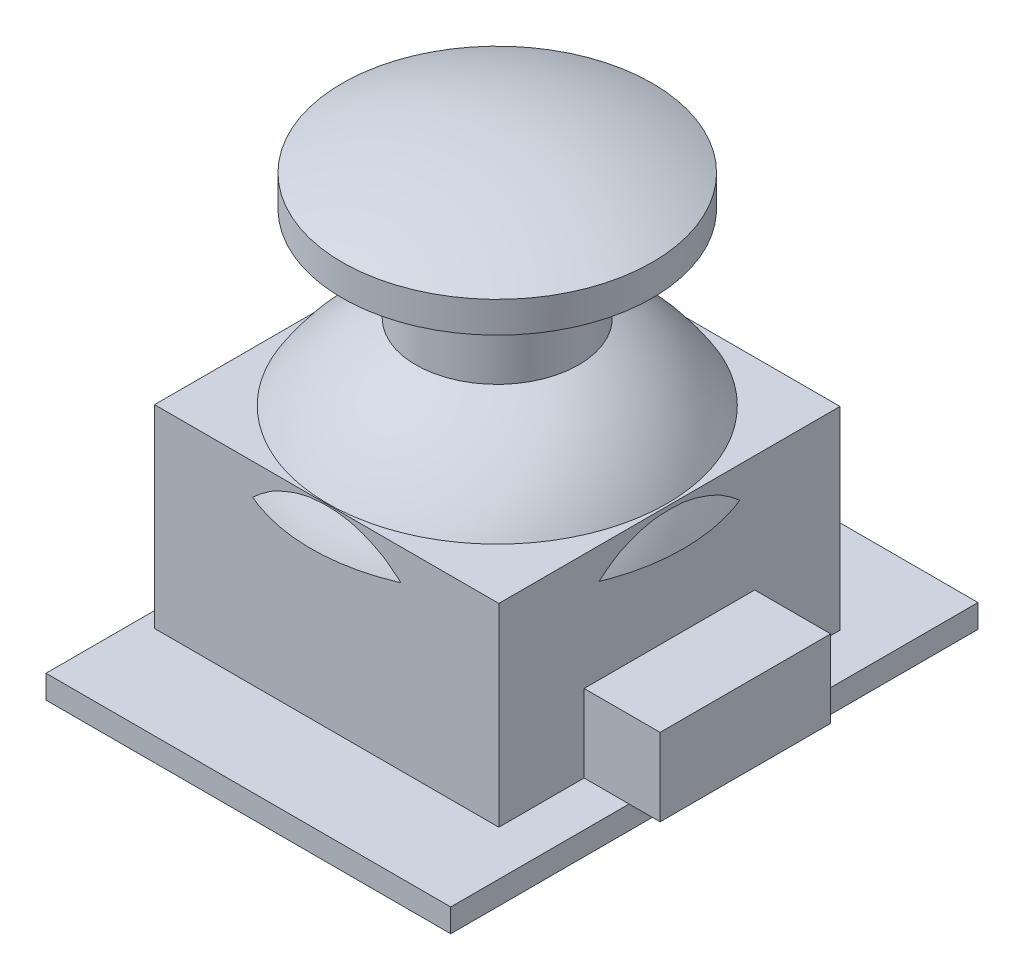
ISO-10303-21;
HEADER;
FILE_DESCRIPTION(('STEP AP214'),'2;1');
FILE_NAME('part.step','',(''),(''),'','','');
FILE_SCHEMA(('AUTOMOTIVE_DESIGN { 1 0 10303 214 1 1 1 1 }'));
ENDSEC;
DATA;
#1=APPLICATION_CONTEXT('core data for automotive mechanical design processes');
#2=APPLICATION_PROTOCOL_DEFINITION('international standard','automotive_design',2000,#1);
#3=PRODUCT_CONTEXT('',#1,'mechanical');
#4=PRODUCT('Part','Part','',(#3));
#5=PRODUCT_RELATED_PRODUCT_CATEGORY('part','',(#4));
#6=PRODUCT_DEFINITION_FORMATION('','',#4);
#7=PRODUCT_DEFINITION_CONTEXT('part definition',#1,'design');
#8=PRODUCT_DEFINITION('design','',#6,#7);
#9=PRODUCT_DEFINITION_SHAPE('','',#8);
#10=(LENGTH_UNIT() NAMED_UNIT(*) SI_UNIT(.MILLI.,.METRE.));
#11=(NAMED_UNIT(*) PLANE_ANGLE_UNIT() SI_UNIT($,.RADIAN.));
#12=(NAMED_UNIT(*) SI_UNIT($,.STERADIAN.) SOLID_ANGLE_UNIT());
#13=UNCERTAINTY_MEASURE_WITH_UNIT(LENGTH_MEASURE(1.E-05),#10,'distance_accuracy_value','');
#14=(GEOMETRIC_REPRESENTATION_CONTEXT(3) GLOBAL_UNCERTAINTY_ASSIGNED_CONTEXT((#13)) GLOBAL_UNIT_ASSIGNED_CONTEXT((#10,
#11,#12)) REPRESENTATION_CONTEXT('',''));
#15=CARTESIAN_POINT('',(0.,0.,0.));
#16=DIRECTION('',(0.,0.,1.));
#17=DIRECTION('',(1.,0.,0.));
#18=AXIS2_PLACEMENT_3D('',#15,#16,#17);
#19=CARTESIAN_POINT('',(4.3,25.0000000000001,0.));
#20=DIRECTION('',(0.,-1.,0.));
#21=DIRECTION('',(0.,0.,-1.));
#22=AXIS2_PLACEMENT_3D('',#19,#20,#21);
#23=PLANE('',#22);
#24=CARTESIAN_POINT('',(-0.95,25.0000000000001,0.));
#25=DIRECTION('',(0.,-1.,0.));
#26=DIRECTION('',(0.,0.,-1.));
#27=AXIS2_PLACEMENT_3D('',#24,#25,#26);
#28=CIRCLE('',#27,10.);
#29=CARTESIAN_POINT('',(-0.95,25.0000000000001,-10.));
#30=VERTEX_POINT('',#29);
#31=EDGE_CURVE('E77',#30,#30,#28,.T.);
#32=ORIENTED_EDGE('',*,*,#31,.T.);
#33=EDGE_LOOP('',(#32));
#34=FACE_BOUND('',#33,.T.);
#35=CARTESIAN_POINT('',(-0.95,25.0000000000001,0.));
#36=DIRECTION('',(0.,-1.,0.));
#37=DIRECTION('',(0.,0.,-1.));
#38=AXIS2_PLACEMENT_3D('',#35,#36,#37);
#39=CIRCLE('',#38,5.25);
#40=CARTESIAN_POINT('',(-0.95,25.0000000000001,-5.25));
#41=VERTEX_POINT('',#40);
#42=EDGE_CURVE('E12',#41,#41,#39,.T.);
#43=ORIENTED_EDGE('',*,*,#42,.F.);
#44=EDGE_LOOP('',(#43));
#45=FACE_BOUND('',#44,.T.);
#46=ADVANCED_FACE('F52',(#34,#45),#23,.T.);
#47=CARTESIAN_POINT('',(-0.95,-961.886040234275,0.));
#48=DIRECTION('',(0.,-1.,0.));
#49=DIRECTION('',(0.,0.,-1.));
#50=AXIS2_PLACEMENT_3D('',#47,#48,#49);
#51=CYLINDRICAL_SURFACE('',#50,5.25);
#52=ORIENTED_EDGE('',*,*,#42,.T.);
#53=EDGE_LOOP('',(#52));
#54=FACE_BOUND('',#53,.T.);
#55=CARTESIAN_POINT('',(-0.95,18.8927498922663,0.));
#56=DIRECTION('',(0.,-1.,0.));
#57=DIRECTION('',(0.,0.,-1.));
#58=AXIS2_PLACEMENT_3D('',#55,#56,#57);
#59=CIRCLE('',#58,5.25);
#60=CARTESIAN_POINT('',(4.30000000000006,18.8927498922663,0.));
#61=VERTEX_POINT('',#60);
#62=EDGE_CURVE('E58',#61,#61,#59,.T.);
#63=ORIENTED_EDGE('',*,*,#62,.F.);
#64=EDGE_LOOP('',(#63));
#65=FACE_BOUND('',#64,.T.);
#66=ADVANCED_FACE('F95',(#54,#65),#51,.T.);
#67=CARTESIAN_POINT('',(-0.95,7.00000000000012,0.));
#68=DIRECTION('',(0.,-1.,0.));
#69=DIRECTION('',(1.,0.,0.));
#70=AXIS2_PLACEMENT_3D('',#67,#68,#69);
#71=SPHERICAL_SURFACE('',#70,12.9999999999999);
#72=CARTESIAN_POINT('',(-0.95,12.0000000000001,0.));
#73=DIRECTION('',(0.,-1.,0.));
#74=DIRECTION('',(0.,0.,-1.));
#75=AXIS2_PLACEMENT_3D('',#72,#73,#74);
#76=CIRCLE('',#75,11.9999999999999);
#77=CARTESIAN_POINT('',(11.0499999999999,12.0000000000001,0.));
#78=VERTEX_POINT('',#77);
#79=EDGE_CURVE('E62',#78,#78,#76,.T.);
#80=CARTESIAN_POINT('',(4.30000000000006,18.8927498922663,0.));
#81=CARTESIAN_POINT('',(4.39418672031377,18.8511718666741,0.));
#82=CARTESIAN_POINT('',(4.48787930585906,18.8084745099224,0.));
#83=CARTESIAN_POINT('',(4.67422378465902,18.7208662206368,0.));
#84=CARTESIAN_POINT('',(4.76687567791369,18.6759552881029,0.));
#85=CARTESIAN_POINT('',(4.95108634937865,18.5839449337896,0.));
#86=CARTESIAN_POINT('',(5.04264512758895,18.5368455120101,0.));
#87=CARTESIAN_POINT('',(5.22461792063713,18.4404848358626,0.));
#88=CARTESIAN_POINT('',(5.31503193547502,18.3912235814946,0.));
#89=CARTESIAN_POINT('',(5.49466415745175,18.2905670273936,0.));
#90=CARTESIAN_POINT('',(5.58388236459059,18.2391717276606,0.));
#91=CARTESIAN_POINT('',(5.7610726131334,18.1342760986818,0.));
#92=CARTESIAN_POINT('',(5.84904465453736,18.080775769436,0.));
#93=CARTESIAN_POINT('',(6.02369291396159,17.9717002790548,0.));
#94=CARTESIAN_POINT('',(6.11036913198186,17.9161251179196,0.));
#95=CARTESIAN_POINT('',(6.2823768192463,17.8029313342759,0.));
#96=CARTESIAN_POINT('',(6.36770828849047,17.7453127117675,0.));
#97=CARTESIAN_POINT('',(6.53697831165454,17.6280645288908,0.));
#98=CARTESIAN_POINT('',(6.62091686557444,17.5684349685225,0.));
#99=CARTESIAN_POINT('',(6.78735367784997,17.4471985686642,0.));
#100=CARTESIAN_POINT('',(6.86985193620558,17.3855917291743,0.));
#101=CARTESIAN_POINT('',(7.03336159009123,17.2604355458797,0.));
#102=CARTESIAN_POINT('',(7.11437298562125,17.196886202075,0.));
#103=CARTESIAN_POINT('',(7.27486318587842,17.0678808814398,0.));
#104=CARTESIAN_POINT('',(7.35434199060556,17.0024249046093,0.));
#105=CARTESIAN_POINT('',(7.51172214637016,16.8696432654333,0.));
#106=CARTESIAN_POINT('',(7.58962349740762,16.8023176030879,0.));
#107=CARTESIAN_POINT('',(7.74380477332143,16.6658345957634,0.));
#108=CARTESIAN_POINT('',(7.82008469819778,16.5966772507843,0.));
#109=CARTESIAN_POINT('',(7.97098006455382,16.4565699149912,0.));
#110=CARTESIAN_POINT('',(8.04559550603349,16.3856199241772,0.));
#111=CARTESIAN_POINT('',(8.1931197879008,16.2419673453967,0.));
#112=CARTESIAN_POINT('',(8.26602862828843,16.1692647574302,0.));
#113=CARTESIAN_POINT('',(8.41009855359032,16.0221480223037,0.));
#114=CARTESIAN_POINT('',(8.48125963850459,15.9477338751439,0.));
#115=CARTESIAN_POINT('',(8.62179388502267,15.7972360257029,0.));
#116=CARTESIAN_POINT('',(8.69116704662649,15.7211523234219,0.));
#117=CARTESIAN_POINT('',(8.82808628790408,15.5673583102135,0.));
#118=CARTESIAN_POINT('',(8.89563236757786,15.4896479992863,0.));
#119=CARTESIAN_POINT('',(9.02885931769694,15.332644633422,0.));
#120=CARTESIAN_POINT('',(9.09454018814224,15.2533515784849,0.));
#121=CARTESIAN_POINT('',(9.22399964534833,15.0932274826384,0.));
#122=CARTESIAN_POINT('',(9.28777823210913,15.012396441729,0.));
#123=CARTESIAN_POINT('',(9.41339712126059,14.8492420001127,0.));
#124=CARTESIAN_POINT('',(9.47523742365126,14.7669185994058,0.));
#125=CARTESIAN_POINT('',(9.59694483746529,14.6008259067508,0.));
#126=CARTESIAN_POINT('',(9.65681194888864,14.5170566148028,0.));
#127=CARTESIAN_POINT('',(9.77453918797416,14.3481194243789,0.));
#128=CARTESIAN_POINT('',(9.83239931563632,14.262951525903,0.));
#129=CARTESIAN_POINT('',(9.94607992724119,14.0912651965841,0.));
#130=CARTESIAN_POINT('',(10.0019004111839,14.0047467657411,0.));
#131=CARTESIAN_POINT('',(10.1114702268212,13.8304082082306,0.));
#132=CARTESIAN_POINT('',(10.1652195585158,13.7425880815631,0.));
#133=CARTESIAN_POINT('',(10.2706167297512,13.5656957034985,0.));
#134=CARTESIAN_POINT('',(10.3222645692921,13.4766234521013,0.));
#135=CARTESIAN_POINT('',(10.4234296042724,13.2972771032259,0.));
#136=CARTESIAN_POINT('',(10.4729467997119,13.2070030057476,0.));
#137=CARTESIAN_POINT('',(10.5698225907102,13.0253039188643,0.));
#138=CARTESIAN_POINT('',(10.617181186269,12.9338789294592,0.));
#139=CARTESIAN_POINT('',(10.7097130644459,12.7499296733084,0.));
#140=CARTESIAN_POINT('',(10.754886347064,12.6574054065628,0.));
#141=CARTESIAN_POINT('',(10.8430220292575,12.4713097905297,0.));
#142=CARTESIAN_POINT('',(10.8859844288328,12.3777384412423,0.));
#143=CARTESIAN_POINT('',(10.9696743608196,12.1896015963266,0.));
#144=CARTESIAN_POINT('',(11.010401893231,12.0950361006983,0.));
#145=CARTESIAN_POINT('',(11.0499999999999,12.0000000000001,0.));
#146=B_SPLINE_CURVE_WITH_KNOTS('',3,(#80,#81,#82,#83,#84,#85,#86,#87,#88,#89,#90,#91,#92,#93,
#94,#95,#96,#97,#98,#99,#100,#101,#102,#103,#104,#105,#106,#107,#108,#109,#110,#111,#112,#113,
#114,#115,#116,#117,#118,#119,#120,#121,#122,#123,#124,#125,#126,#127,#128,#129,#130,#131,#132,
#133,#134,#135,#136,#137,#138,#139,#140,#141,#142,#143,#144,#145),.UNSPECIFIED.,.F.,.F.,(4,2,2,
2,2,2,2,2,2,2,2,2,2,2,2,2,2,2,2,2,2,2,2,2,2,2,2,2,2,2,2,2,4),(0.,0.308859735682066,
0.617719471364132,0.926579207046198,1.23543894272826,1.54429867841033,1.85315841409239,
2.16201814977446,2.47087788545653,2.77973762113859,3.08859735682066,3.39745709250272,
3.70631682818479,4.01517656386685,4.32403629954892,4.63289603523098,4.94175577091305,
5.25061550659512,5.55947524227718,5.86833497795925,6.17719471364132,6.48605444932338,
6.79491418500545,7.10377392068751,7.41263365636958,7.72149339205164,8.03035312773371,
8.33921286341577,8.64807259909784,8.9569323347799,9.26579207046197,9.57465180614404,
9.8835115418261),.UNSPECIFIED.);
#147=EDGE_CURVE('BSEAM99',#61,#78,#146,.T.);
#148=ORIENTED_EDGE('',*,*,#62,.T.);
#149=ORIENTED_EDGE('',*,*,#79,.F.);
#150=ORIENTED_EDGE('',*,*,#147,.T.);
#151=ORIENTED_EDGE('',*,*,#147,.F.);
#152=EDGE_LOOP('',(#148,#150,#149,#151));
#153=FACE_BOUND('',#152,.T.);
#154=ADVANCED_FACE('F99',(#153),#71,.T.);
#155=CARTESIAN_POINT('',(10.5064392373896,12.0000000000001,0.));
#156=DIRECTION('',(0.,-1.,0.));
#157=DIRECTION('',(0.,0.,-1.));
#158=AXIS2_PLACEMENT_3D('',#155,#156,#157);
#159=PLANE('',#158);
#160=ORIENTED_EDGE('',*,*,#79,.T.);
#161=EDGE_LOOP('',(#160));
#162=FACE_BOUND('',#161,.T.);
#163=CARTESIAN_POINT('',(-0.95,12.0000000000001,0.));
#164=DIRECTION('',(0.,-1.,0.));
#165=DIRECTION('',(0.,0.,-1.));
#166=AXIS2_PLACEMENT_3D('',#163,#164,#165);
#167=CIRCLE('',#166,11.4564392373896);
#168=CARTESIAN_POINT('',(10.5064392373895,12.0000000000001,0.));
#169=VERTEX_POINT('',#168);
#170=EDGE_CURVE('E66',#169,#169,#167,.T.);
#171=ORIENTED_EDGE('',*,*,#170,.F.);
#172=EDGE_LOOP('',(#171));
#173=FACE_BOUND('',#172,.T.);
#174=ADVANCED_FACE('F103',(#162,#173),#159,.T.);
#175=CARTESIAN_POINT('',(-0.950000000000006,7.00000000000012,0.));
#176=DIRECTION('',(0.,-1.,0.));
#177=DIRECTION('',(1.,0.,0.));
#178=AXIS2_PLACEMENT_3D('',#175,#176,#177);
#179=SPHERICAL_SURFACE('',#178,12.4999999999999);
#180=CARTESIAN_POINT('',(-0.95,18.3440513045384,0.));
#181=DIRECTION('',(0.,-1.,0.));
#182=DIRECTION('',(0.,0.,-1.));
#183=AXIS2_PLACEMENT_3D('',#180,#181,#182);
#184=CIRCLE('',#183,5.25000000000002);
#185=CARTESIAN_POINT('',(4.30000000000013,18.3440513045384,0.));
#186=VERTEX_POINT('',#185);
#187=EDGE_CURVE('E71',#186,#186,#184,.T.);
#188=CARTESIAN_POINT('',(10.5064392373895,12.0000000000001,0.));
#189=CARTESIAN_POINT('',(10.4686355545706,12.0866196139958,0.));
#190=CARTESIAN_POINT('',(10.4298491526026,12.1728103257044,0.));
#191=CARTESIAN_POINT('',(10.3503316536855,12.3442899682968,0.));
#192=CARTESIAN_POINT('',(10.3096005567365,12.4295788991805,0.));
#193=CARTESIAN_POINT('',(10.2262144111743,12.599211003872,0.));
#194=CARTESIAN_POINT('',(10.1835593625611,12.6835541776798,0.));
#195=CARTESIAN_POINT('',(10.0963473148718,12.851251402839,0.));
#196=CARTESIAN_POINT('',(10.0517903157956,12.9346054541903,0.));
#197=CARTESIAN_POINT('',(9.96079727503803,13.1002815446163,0.));
#198=CARTESIAN_POINT('',(9.91436123335662,13.1826035836909,0.));
#199=CARTESIAN_POINT('',(9.81963400119598,13.3461732996029,0.));
#200=CARTESIAN_POINT('',(9.77134281071675,13.4274209764403,0.));
#201=CARTESIAN_POINT('',(9.67293012402063,13.5888001682483,0.));
#202=CARTESIAN_POINT('',(9.62280862780375,13.6689316832188,0.));
#203=CARTESIAN_POINT('',(9.52076111570348,13.828037326531,0.));
#204=CARTESIAN_POINT('',(9.4688350998201,13.9070114548726,0.));
#205=CARTESIAN_POINT('',(9.36320526245077,14.0637616954284,0.));
#206=CARTESIAN_POINT('',(9.30950144096483,14.1415378076427,0.));
#207=CARTESIAN_POINT('',(9.20034362117312,14.2958520028294,0.));
#208=CARTESIAN_POINT('',(9.14488962286736,14.3723900858019,0.));
#209=CARTESIAN_POINT('',(9.03225997859773,14.5241888463016,0.));
#210=CARTESIAN_POINT('',(8.97508433263386,14.5994495238289,0.));
#211=CARTESIAN_POINT('',(8.8590408079451,14.748654754419,0.));
#212=CARTESIAN_POINT('',(8.80017292922022,14.8225993074818,0.));
#213=CARTESIAN_POINT('',(8.68077522449996,14.9691342472237,0.));
#214=CARTESIAN_POINT('',(8.62024539850458,15.0417246339027,0.));
#215=CARTESIAN_POINT('',(8.49755493974884,15.1855138956294,0.));
#216=CARTESIAN_POINT('',(8.43539430698847,15.2567127706772,0.));
#217=CARTESIAN_POINT('',(8.30947421420189,15.3976823797787,0.));
#218=CARTESIAN_POINT('',(8.24571475417568,15.4674531138324,0.));
#219=CARTESIAN_POINT('',(8.11662980889801,15.6055305463125,0.));
#220=CARTESIAN_POINT('',(8.05130432364655,15.6738372447387,0.));
#221=CARTESIAN_POINT('',(7.91912093562489,15.808951464526,0.));
#222=CARTESIAN_POINT('',(7.85226303285468,15.8757589858871,0.));
#223=CARTESIAN_POINT('',(7.71704920587791,16.007840481381,0.));
#224=CARTESIAN_POINT('',(7.64869328167135,16.0731144555139,0.));
#225=CARTESIAN_POINT('',(7.51051857858457,16.2020952753457,0.));
#226=CARTESIAN_POINT('',(7.44069979970435,16.2658021210447,0.));
#227=CARTESIAN_POINT('',(7.29963530662119,16.3916159090363,0.));
#228=CARTESIAN_POINT('',(7.22838959241825,16.453722851329,0.));
#229=CARTESIAN_POINT('',(7.08450788214944,16.5763048806308,0.));
#230=CARTESIAN_POINT('',(7.01187188608359,16.6367799676398,0.));
#231=CARTESIAN_POINT('',(6.86524698080104,16.7560671740306,0.));
#232=CARTESIAN_POINT('',(6.79125807158435,16.8148792934124,0.));
#233=CARTESIAN_POINT('',(6.64196540473839,16.9308103077423,0.));
#234=CARTESIAN_POINT('',(6.56666164710912,16.9879292026906,0.));
#235=CARTESIAN_POINT('',(6.41477802462381,17.10044438246,0.));
#236=CARTESIAN_POINT('',(6.33819815976777,17.1558406672812,0.));
#237=CARTESIAN_POINT('',(6.18380172051494,17.2648821273,0.));
#238=CARTESIAN_POINT('',(6.10598514611815,17.3185273024977,0.));
#239=CARTESIAN_POINT('',(5.94915532176236,17.4240389447565,0.));
#240=CARTESIAN_POINT('',(5.87014207180336,17.4759054118177,0.));
#241=CARTESIAN_POINT('',(5.71095954577016,17.5778329540084,0.));
#242=CARTESIAN_POINT('',(5.63079026969597,17.6278940291379,0.));
#243=CARTESIAN_POINT('',(5.46933693628586,17.726185033849,0.));
#244=CARTESIAN_POINT('',(5.38805287894995,17.7744149634307,0.));
#245=CARTESIAN_POINT('',(5.22441179888237,17.8690188603877,0.));
#246=CARTESIAN_POINT('',(5.14205477615071,17.915392827763,0.));
#247=CARTESIAN_POINT('',(4.97631014250623,18.0062609575243,0.));
#248=CARTESIAN_POINT('',(4.89292253159343,18.0507551199101,0.));
#249=CARTESIAN_POINT('',(4.72515959412726,18.1378406929204,0.));
#250=CARTESIAN_POINT('',(4.64078426757391,18.1804321035448,0.));
#251=CARTESIAN_POINT('',(4.47108940967204,18.2636904704474,0.));
#252=CARTESIAN_POINT('',(4.38576987832352,18.3043574267256,0.));
#253=CARTESIAN_POINT('',(4.30000000000013,18.3440513045384,0.));
#254=B_SPLINE_CURVE_WITH_KNOTS('',3,(#188,#189,#190,#191,#192,#193,#194,#195,#196,#197,#198,
#199,#200,#201,#202,#203,#204,#205,#206,#207,#208,#209,#210,#211,#212,#213,#214,#215,#216,#217,
#218,#219,#220,#221,#222,#223,#224,#225,#226,#227,#228,#229,#230,#231,#232,#233,#234,#235,#236,
#237,#238,#239,#240,#241,#242,#243,#244,#245,#246,#247,#248,#249,#250,#251,#252,#253),
.UNSPECIFIED.,.F.,.F.,(4,2,2,2,2,2,2,2,2,2,2,2,2,2,2,2,2,2,2,2,2,2,2,2,2,2,2,2,2,2,2,2,4),(0.,
0.283522891040992,0.567045782081985,0.850568673122977,1.13409156416397,1.41761445520496,
1.70113734624595,1.98466023728694,2.26818312832793,2.55170601936893,2.83522891040992,
3.11875180145091,3.4022746924919,3.68579758353289,3.96932047457388,4.25284336561488,
4.53636625665587,4.81988914769686,5.10341203873785,5.38693492977884,5.67045782081983,
5.95398071186083,6.23750360290182,6.52102649394281,6.8045493849838,7.08807227602479,
7.37159516706578,7.65511805810678,7.93864094914777,8.22216384018876,8.50568673122975,
8.78920962227074,9.07273251331173),.UNSPECIFIED.);
#255=EDGE_CURVE('BSEAM109',#169,#186,#254,.T.);
#256=ORIENTED_EDGE('',*,*,#170,.T.);
#257=ORIENTED_EDGE('',*,*,#187,.F.);
#258=ORIENTED_EDGE('',*,*,#255,.T.);
#259=ORIENTED_EDGE('',*,*,#255,.F.);
#260=EDGE_LOOP('',(#256,#258,#257,#259));
#261=FACE_BOUND('',#260,.T.);
#262=ADVANCED_FACE('F109',(#261),#179,.F.);
#263=CARTESIAN_POINT('',(4.3,18.3440513045384,0.));
#264=DIRECTION('',(0.,-1.,0.));
#265=DIRECTION('',(0.,0.,-1.));
#266=AXIS2_PLACEMENT_3D('',#263,#264,#265);
#267=PLANE('',#266);
#268=ORIENTED_EDGE('',*,*,#187,.T.);
#269=EDGE_LOOP('',(#268));
#270=FACE_BOUND('',#269,.T.);
#271=ADVANCED_FACE('F91',(#270),#267,.T.);
#272=CARTESIAN_POINT('',(-0.95,5.37272727272611,0.));
#273=DIRECTION('',(0.,-1.,0.));
#274=DIRECTION('',(1.,0.,0.));
#275=AXIS2_PLACEMENT_3D('',#272,#273,#274);
#276=SPHERICAL_SURFACE('',#275,23.8272727272739);
#277=CARTESIAN_POINT('',(-0.95,27.0000000000001,0.));
#278=DIRECTION('',(0.,-1.,0.));
#279=DIRECTION('',(0.,0.,-1.));
#280=AXIS2_PLACEMENT_3D('',#277,#278,#279);
#281=CIRCLE('',#280,10.);
#282=CARTESIAN_POINT('',(-0.95,27.0000000000001,-10.));
#283=VERTEX_POINT('',#282);
#284=EDGE_CURVE('E74',#283,#283,#281,.T.);
#285=ORIENTED_EDGE('',*,*,#284,.F.);
#286=EDGE_LOOP('',(#285));
#287=FACE_BOUND('',#286,.T.);
#288=ADVANCED_FACE('F85',(#287),#276,.T.);
#289=CARTESIAN_POINT('',(-0.95,-961.886040234275,0.));
#290=DIRECTION('',(0.,-1.,0.));
#291=DIRECTION('',(0.,0.,-1.));
#292=AXIS2_PLACEMENT_3D('',#289,#290,#291);
#293=CYLINDRICAL_SURFACE('',#292,10.);
#294=ORIENTED_EDGE('',*,*,#284,.T.);
#295=EDGE_LOOP('',(#294));
#296=FACE_BOUND('',#295,.T.);
#297=ORIENTED_EDGE('',*,*,#31,.F.);
#298=EDGE_LOOP('',(#297));
#299=FACE_BOUND('',#298,.T.);
#300=ADVANCED_FACE('F83',(#296,#299),#293,.T.);
#301=CLOSED_SHELL('',(#46,#66,#154,#174,#262,#271,#288,#300));
#302=MANIFOLD_SOLID_BREP('B2',#301);
#303=CARTESIAN_POINT('',(0.,21.5,0.));
#304=DIRECTION('',(0.,-1.,0.));
#305=DIRECTION('',(0.,0.,-1.));
#306=AXIS2_PLACEMENT_3D('',#303,#304,#305);
#307=CYLINDRICAL_SURFACE('',#306,2.);
#308=CARTESIAN_POINT('',(0.,14.,0.));
#309=DIRECTION('',(0.,1.,0.));
#310=DIRECTION('',(0.,0.,1.));
#311=AXIS2_PLACEMENT_3D('',#308,#309,#310);
#312=CIRCLE('',#311,2.);
#313=CARTESIAN_POINT('',(0.,14.,2.));
#314=VERTEX_POINT('',#313);
#315=EDGE_CURVE('E291',#314,#314,#312,.T.);
#316=ORIENTED_EDGE('',*,*,#315,.T.);
#317=EDGE_LOOP('',(#316));
#318=FACE_BOUND('',#317,.T.);
#319=DIRECTION('',(0.,1.,0.));
#320=VECTOR('',#319,1.);
#321=CARTESIAN_POINT('',(-1.5,11.3074175964327,-1.32287565553229));
#322=LINE('',#321,#320);
#323=CARTESIAN_POINT('',(-1.5,15.,-1.32287565553229));
#324=VERTEX_POINT('',#323);
#325=CARTESIAN_POINT('',(-1.5,21.5,-1.32287565553229));
#326=VERTEX_POINT('',#325);
#327=EDGE_CURVE('E269',#324,#326,#322,.T.);
#328=ORIENTED_EDGE('',*,*,#327,.T.);
#329=CARTESIAN_POINT('',(0.,21.5,0.));
#330=DIRECTION('',(0.,1.,0.));
#331=DIRECTION('',(0.,0.,1.));
#332=AXIS2_PLACEMENT_3D('',#329,#330,#331);
#333=CIRCLE('',#332,2.);
#334=CARTESIAN_POINT('',(1.5,21.5,-1.32287565553229));
#335=VERTEX_POINT('',#334);
#336=EDGE_CURVE('E276',#335,#326,#333,.T.);
#337=ORIENTED_EDGE('',*,*,#336,.F.);
#338=DIRECTION('',(0.,1.,0.));
#339=VECTOR('',#338,1.);
#340=CARTESIAN_POINT('',(1.5,11.3074175964327,-1.32287565553229));
#341=LINE('',#340,#339);
#342=CARTESIAN_POINT('',(1.5,15.,-1.32287565553229));
#343=VERTEX_POINT('',#342);
#344=EDGE_CURVE('E200',#343,#335,#341,.T.);
#345=ORIENTED_EDGE('',*,*,#344,.F.);
#346=CARTESIAN_POINT('',(0.,15.,0.));
#347=DIRECTION('',(0.,1.,0.));
#348=DIRECTION('',(0.,0.,1.));
#349=AXIS2_PLACEMENT_3D('',#346,#347,#348);
#350=CIRCLE('',#349,2.);
#351=CARTESIAN_POINT('',(1.5,15.,1.32287565553229));
#352=VERTEX_POINT('',#351);
#353=EDGE_CURVE('E185',#352,#343,#350,.T.);
#354=ORIENTED_EDGE('',*,*,#353,.F.);
#355=DIRECTION('',(0.,1.,0.));
#356=VECTOR('',#355,1.);
#357=CARTESIAN_POINT('',(1.5,11.3074175964327,1.32287565553229));
#358=LINE('',#357,#356);
#359=CARTESIAN_POINT('',(1.5,21.5,1.32287565553229));
#360=VERTEX_POINT('',#359);
#361=EDGE_CURVE('E289',#352,#360,#358,.T.);
#362=ORIENTED_EDGE('',*,*,#361,.T.);
#363=CARTESIAN_POINT('',(-1.5,21.5,1.3228756555323));
#364=VERTEX_POINT('',#363);
#365=EDGE_CURVE('E282',#364,#360,#333,.T.);
#366=ORIENTED_EDGE('',*,*,#365,.F.);
#367=DIRECTION('',(0.,1.,0.));
#368=VECTOR('',#367,1.);
#369=CARTESIAN_POINT('',(-1.5,11.3074175964327,1.32287565553229));
#370=LINE('',#369,#368);
#371=CARTESIAN_POINT('',(-1.5,15.,1.32287565553229));
#372=VERTEX_POINT('',#371);
#373=EDGE_CURVE('E192',#372,#364,#370,.T.);
#374=ORIENTED_EDGE('',*,*,#373,.F.);
#375=CARTESIAN_POINT('',(0.,15.,0.));
#376=DIRECTION('',(0.,1.,0.));
#377=DIRECTION('',(0.,0.,1.));
#378=AXIS2_PLACEMENT_3D('',#375,#376,#377);
#379=CIRCLE('',#378,2.);
#380=EDGE_CURVE('E50',#324,#372,#379,.T.);
#381=ORIENTED_EDGE('',*,*,#380,.F.);
#382=EDGE_LOOP('',(#328,#337,#345,#354,#362,#366,#374,#381));
#383=FACE_BOUND('',#382,.T.);
#384=ADVANCED_FACE('F177',(#318,#383),#307,.T.);
#385=CARTESIAN_POINT('',(0.,21.5,0.));
#386=DIRECTION('',(0.,1.,0.));
#387=DIRECTION('',(0.,0.,1.));
#388=AXIS2_PLACEMENT_3D('',#385,#386,#387);
#389=PLANE('',#388);
#390=ORIENTED_EDGE('',*,*,#336,.T.);
#391=DIRECTION('',(0.,0.,1.));
#392=VECTOR('',#391,1.);
#393=CARTESIAN_POINT('',(-1.5,21.5,-1.32287565553229));
#394=LINE('',#393,#392);
#395=EDGE_CURVE('E266',#326,#364,#394,.T.);
#396=ORIENTED_EDGE('',*,*,#395,.T.);
#397=ORIENTED_EDGE('',*,*,#365,.T.);
#398=DIRECTION('',(0.,0.,1.));
#399=VECTOR('',#398,1.);
#400=CARTESIAN_POINT('',(1.5,21.5,-1.32287565553229));
#401=LINE('',#400,#399);
#402=EDGE_CURVE('E280',#335,#360,#401,.T.);
#403=ORIENTED_EDGE('',*,*,#402,.F.);
#404=EDGE_LOOP('',(#390,#396,#397,#403));
#405=FACE_BOUND('',#404,.T.);
#406=ADVANCED_FACE('F279',(#405),#389,.T.);
#407=CARTESIAN_POINT('',(10.15,14.,-11.));
#408=DIRECTION('',(-1.,0.,0.));
#409=DIRECTION('',(0.,0.,1.));
#410=AXIS2_PLACEMENT_3D('',#407,#408,#409);
#411=PLANE('',#410);
#412=DIRECTION('',(0.,-1.,0.));
#413=VECTOR('',#412,1.);
#414=CARTESIAN_POINT('',(10.15,6.5,5.5));
#415=LINE('',#414,#413);
#416=CARTESIAN_POINT('',(10.15,6.5,5.5));
#417=VERTEX_POINT('',#416);
#418=CARTESIAN_POINT('',(10.15,1.5,5.5));
#419=VERTEX_POINT('',#418);
#420=EDGE_CURVE('E316',#417,#419,#415,.T.);
#421=ORIENTED_EDGE('',*,*,#420,.F.);
#422=DIRECTION('',(0.,0.,1.));
#423=VECTOR('',#422,1.);
#424=CARTESIAN_POINT('',(10.15,6.5,-5.5));
#425=LINE('',#424,#423);
#426=CARTESIAN_POINT('',(10.15,6.5,-5.5));
#427=VERTEX_POINT('',#426);
#428=EDGE_CURVE('E295',#427,#417,#425,.T.);
#429=ORIENTED_EDGE('',*,*,#428,.F.);
#430=DIRECTION('',(0.,-1.,0.));
#431=VECTOR('',#430,1.);
#432=CARTESIAN_POINT('',(10.15,6.5,-5.5));
#433=LINE('',#432,#431);
#434=CARTESIAN_POINT('',(10.15,1.5,-5.5));
#435=VERTEX_POINT('',#434);
#436=EDGE_CURVE('E304',#427,#435,#433,.T.);
#437=ORIENTED_EDGE('',*,*,#436,.T.);
#438=DIRECTION('',(0.,0.,-1.));
#439=VECTOR('',#438,1.);
#440=CARTESIAN_POINT('',(10.15,1.5,-11.));
#441=LINE('',#440,#439);
#442=CARTESIAN_POINT('',(10.15,1.5,-11.));
#443=VERTEX_POINT('',#442);
#444=EDGE_CURVE('E319',#435,#443,#441,.T.);
#445=ORIENTED_EDGE('',*,*,#444,.T.);
#446=DIRECTION('',(0.,-1.,0.));
#447=VECTOR('',#446,1.);
#448=CARTESIAN_POINT('',(10.15,14.,-11.));
#449=LINE('',#448,#447);
#450=CARTESIAN_POINT('',(10.15,14.,-11.));
#451=VERTEX_POINT('',#450);
#452=EDGE_CURVE('E294',#451,#443,#449,.T.);
#453=ORIENTED_EDGE('',*,*,#452,.F.);
#454=DIRECTION('',(0.,0.,-1.));
#455=VECTOR('',#454,1.);
#456=CARTESIAN_POINT('',(10.15,14.,-11.));
#457=LINE('',#456,#455);
#458=CARTESIAN_POINT('',(10.15,14.,11.));
#459=VERTEX_POINT('',#458);
#460=EDGE_CURVE('E320',#459,#451,#457,.T.);
#461=ORIENTED_EDGE('',*,*,#460,.F.);
#462=DIRECTION('',(0.,-1.,0.));
#463=VECTOR('',#462,1.);
#464=CARTESIAN_POINT('',(10.15,14.,11.));
#465=LINE('',#464,#463);
#466=CARTESIAN_POINT('',(10.15,1.5,11.));
#467=VERTEX_POINT('',#466);
#468=EDGE_CURVE('E330',#459,#467,#465,.T.);
#469=ORIENTED_EDGE('',*,*,#468,.T.);
#470=EDGE_CURVE('E331',#467,#419,#441,.T.);
#471=ORIENTED_EDGE('',*,*,#470,.T.);
#472=EDGE_LOOP('',(#421,#429,#437,#445,#453,#461,#469,#471));
#473=FACE_BOUND('',#472,.T.);
#474=ADVANCED_FACE('F179',(#473),#411,.F.);
#475=CARTESIAN_POINT('',(-12.05,14.,-11.));
#476=DIRECTION('',(0.,0.,1.));
#477=DIRECTION('',(1.,0.,0.));
#478=AXIS2_PLACEMENT_3D('',#475,#476,#477);
#479=PLANE('',#478);
#480=DIRECTION('',(-1.,0.,0.));
#481=VECTOR('',#480,1.);
#482=CARTESIAN_POINT('',(-12.05,1.5,-11.));
#483=LINE('',#482,#481);
#484=CARTESIAN_POINT('',(-12.05,1.5,-11.));
#485=VERTEX_POINT('',#484);
#486=EDGE_CURVE('E334',#443,#485,#483,.T.);
#487=ORIENTED_EDGE('',*,*,#486,.T.);
#488=DIRECTION('',(0.,-1.,0.));
#489=VECTOR('',#488,1.);
#490=CARTESIAN_POINT('',(-12.05,14.,-11.));
#491=LINE('',#490,#489);
#492=CARTESIAN_POINT('',(-12.05,14.,-11.));
#493=VERTEX_POINT('',#492);
#494=EDGE_CURVE('E344',#493,#485,#491,.T.);
#495=ORIENTED_EDGE('',*,*,#494,.F.);
#496=DIRECTION('',(-1.,0.,0.));
#497=VECTOR('',#496,1.);
#498=CARTESIAN_POINT('',(-12.05,14.,-11.));
#499=LINE('',#498,#497);
#500=EDGE_CURVE('E323',#451,#493,#499,.T.);
#501=ORIENTED_EDGE('',*,*,#500,.F.);
#502=ORIENTED_EDGE('',*,*,#452,.T.);
#503=EDGE_LOOP('',(#487,#495,#501,#502));
#504=FACE_BOUND('',#503,.T.);
#505=ADVANCED_FACE('F407',(#504),#479,.F.);
#506=CARTESIAN_POINT('',(-12.05,14.,-11.));
#507=DIRECTION('',(1.,0.,0.));
#508=DIRECTION('',(0.,0.,-1.));
#509=AXIS2_PLACEMENT_3D('',#506,#507,#508);
#510=PLANE('',#509);
#511=DIRECTION('',(0.,0.,1.));
#512=VECTOR('',#511,1.);
#513=CARTESIAN_POINT('',(-12.05,1.5,-11.));
#514=LINE('',#513,#512);
#515=CARTESIAN_POINT('',(-12.05,1.5,11.));
#516=VERTEX_POINT('',#515);
#517=EDGE_CURVE('E336',#485,#516,#514,.T.);
#518=ORIENTED_EDGE('',*,*,#517,.T.);
#519=DIRECTION('',(0.,-1.,0.));
#520=VECTOR('',#519,1.);
#521=CARTESIAN_POINT('',(-12.05,14.,11.));
#522=LINE('',#521,#520);
#523=CARTESIAN_POINT('',(-12.05,14.,11.));
#524=VERTEX_POINT('',#523);
#525=EDGE_CURVE('E341',#524,#516,#522,.T.);
#526=ORIENTED_EDGE('',*,*,#525,.F.);
#527=DIRECTION('',(0.,0.,1.));
#528=VECTOR('',#527,1.);
#529=CARTESIAN_POINT('',(-12.05,14.,-11.));
#530=LINE('',#529,#528);
#531=EDGE_CURVE('E326',#493,#524,#530,.T.);
#532=ORIENTED_EDGE('',*,*,#531,.F.);
#533=ORIENTED_EDGE('',*,*,#494,.T.);
#534=EDGE_LOOP('',(#518,#526,#532,#533));
#535=FACE_BOUND('',#534,.T.);
#536=ADVANCED_FACE('F404',(#535),#510,.F.);
#537=CARTESIAN_POINT('',(-12.05,14.,11.));
#538=DIRECTION('',(0.,0.,-1.));
#539=DIRECTION('',(-1.,0.,0.));
#540=AXIS2_PLACEMENT_3D('',#537,#538,#539);
#541=PLANE('',#540);
#542=DIRECTION('',(1.,0.,0.));
#543=VECTOR('',#542,1.);
#544=CARTESIAN_POINT('',(-12.05,1.5,11.));
#545=LINE('',#544,#543);
#546=EDGE_CURVE('E324',#516,#467,#545,.T.);
#547=ORIENTED_EDGE('',*,*,#546,.T.);
#548=ORIENTED_EDGE('',*,*,#468,.F.);
#549=DIRECTION('',(1.,0.,0.));
#550=VECTOR('',#549,1.);
#551=CARTESIAN_POINT('',(-12.05,14.,11.));
#552=LINE('',#551,#550);
#553=EDGE_CURVE('E328',#524,#459,#552,.T.);
#554=ORIENTED_EDGE('',*,*,#553,.F.);
#555=ORIENTED_EDGE('',*,*,#525,.T.);
#556=EDGE_LOOP('',(#547,#548,#554,#555));
#557=FACE_BOUND('',#556,.T.);
#558=ADVANCED_FACE('F397',(#557),#541,.F.);
#559=CARTESIAN_POINT('',(0.,14.,0.));
#560=DIRECTION('',(0.,1.,0.));
#561=DIRECTION('',(0.,0.,1.));
#562=AXIS2_PLACEMENT_3D('',#559,#560,#561);
#563=PLANE('',#562);
#564=ORIENTED_EDGE('',*,*,#315,.F.);
#565=EDGE_LOOP('',(#564));
#566=FACE_BOUND('',#565,.T.);
#567=ORIENTED_EDGE('',*,*,#460,.T.);
#568=ORIENTED_EDGE('',*,*,#500,.T.);
#569=ORIENTED_EDGE('',*,*,#531,.T.);
#570=ORIENTED_EDGE('',*,*,#553,.T.);
#571=EDGE_LOOP('',(#567,#568,#569,#570));
#572=FACE_BOUND('',#571,.T.);
#573=ADVANCED_FACE('F394',(#566,#572),#563,.T.);
#574=CARTESIAN_POINT('',(0.,1.5,0.));
#575=DIRECTION('',(0.,1.,0.));
#576=DIRECTION('',(0.,0.,1.));
#577=AXIS2_PLACEMENT_3D('',#574,#575,#576);
#578=PLANE('',#577);
#579=ORIENTED_EDGE('',*,*,#470,.F.);
#580=ORIENTED_EDGE('',*,*,#546,.F.);
#581=ORIENTED_EDGE('',*,*,#517,.F.);
#582=ORIENTED_EDGE('',*,*,#486,.F.);
#583=ORIENTED_EDGE('',*,*,#444,.F.);
#584=DIRECTION('',(-1.,0.,0.));
#585=VECTOR('',#584,1.);
#586=CARTESIAN_POINT('',(10.15,1.5,-5.5));
#587=LINE('',#586,#585);
#588=CARTESIAN_POINT('',(15.05,1.5,-5.5));
#589=VERTEX_POINT('',#588);
#590=EDGE_CURVE('E299',#589,#435,#587,.T.);
#591=ORIENTED_EDGE('',*,*,#590,.F.);
#592=DIRECTION('',(0.,0.,-1.));
#593=VECTOR('',#592,1.);
#594=CARTESIAN_POINT('',(15.05,1.5,-5.5));
#595=LINE('',#594,#593);
#596=CARTESIAN_POINT('',(15.05,1.5,5.5));
#597=VERTEX_POINT('',#596);
#598=EDGE_CURVE('E284',#597,#589,#595,.T.);
#599=ORIENTED_EDGE('',*,*,#598,.F.);
#600=DIRECTION('',(1.,0.,0.));
#601=VECTOR('',#600,1.);
#602=CARTESIAN_POINT('',(10.15,1.5,5.5));
#603=LINE('',#602,#601);
#604=EDGE_CURVE('E281',#419,#597,#603,.T.);
#605=ORIENTED_EDGE('',*,*,#604,.F.);
#606=EDGE_LOOP('',(#579,#580,#581,#582,#583,#591,#599,#605));
#607=FACE_BOUND('',#606,.T.);
#608=ADVANCED_FACE('F392',(#607),#578,.F.);
#609=CARTESIAN_POINT('',(10.15,6.5,5.5));
#610=DIRECTION('',(0.,0.,-1.));
#611=DIRECTION('',(-1.,0.,0.));
#612=AXIS2_PLACEMENT_3D('',#609,#610,#611);
#613=PLANE('',#612);
#614=ORIENTED_EDGE('',*,*,#604,.T.);
#615=DIRECTION('',(0.,-1.,0.));
#616=VECTOR('',#615,1.);
#617=CARTESIAN_POINT('',(15.05,6.5,5.5));
#618=LINE('',#617,#616);
#619=CARTESIAN_POINT('',(15.05,6.5,5.5));
#620=VERTEX_POINT('',#619);
#621=EDGE_CURVE('E313',#620,#597,#618,.T.);
#622=ORIENTED_EDGE('',*,*,#621,.F.);
#623=DIRECTION('',(1.,0.,0.));
#624=VECTOR('',#623,1.);
#625=CARTESIAN_POINT('',(10.15,6.5,5.5));
#626=LINE('',#625,#624);
#627=EDGE_CURVE('E298',#417,#620,#626,.T.);
#628=ORIENTED_EDGE('',*,*,#627,.F.);
#629=ORIENTED_EDGE('',*,*,#420,.T.);
#630=EDGE_LOOP('',(#614,#622,#628,#629));
#631=FACE_BOUND('',#630,.T.);
#632=ADVANCED_FACE('F388',(#631),#613,.F.);
#633=CARTESIAN_POINT('',(15.05,6.5,-5.5));
#634=DIRECTION('',(-1.,0.,0.));
#635=DIRECTION('',(0.,0.,1.));
#636=AXIS2_PLACEMENT_3D('',#633,#634,#635);
#637=PLANE('',#636);
#638=ORIENTED_EDGE('',*,*,#598,.T.);
#639=DIRECTION('',(0.,-1.,0.));
#640=VECTOR('',#639,1.);
#641=CARTESIAN_POINT('',(15.05,6.5,-5.5));
#642=LINE('',#641,#640);
#643=CARTESIAN_POINT('',(15.05,6.5,-5.5));
#644=VERTEX_POINT('',#643);
#645=EDGE_CURVE('E310',#644,#589,#642,.T.);
#646=ORIENTED_EDGE('',*,*,#645,.F.);
#647=DIRECTION('',(0.,0.,-1.));
#648=VECTOR('',#647,1.);
#649=CARTESIAN_POINT('',(15.05,6.5,-5.5));
#650=LINE('',#649,#648);
#651=EDGE_CURVE('E301',#620,#644,#650,.T.);
#652=ORIENTED_EDGE('',*,*,#651,.F.);
#653=ORIENTED_EDGE('',*,*,#621,.T.);
#654=EDGE_LOOP('',(#638,#646,#652,#653));
#655=FACE_BOUND('',#654,.T.);
#656=ADVANCED_FACE('F384',(#655),#637,.F.);
#657=CARTESIAN_POINT('',(10.15,6.5,-5.5));
#658=DIRECTION('',(0.,0.,1.));
#659=DIRECTION('',(1.,0.,0.));
#660=AXIS2_PLACEMENT_3D('',#657,#658,#659);
#661=PLANE('',#660);
#662=ORIENTED_EDGE('',*,*,#590,.T.);
#663=ORIENTED_EDGE('',*,*,#436,.F.);
#664=DIRECTION('',(-1.,0.,0.));
#665=VECTOR('',#664,1.);
#666=CARTESIAN_POINT('',(10.15,6.5,-5.5));
#667=LINE('',#666,#665);
#668=EDGE_CURVE('E303',#644,#427,#667,.T.);
#669=ORIENTED_EDGE('',*,*,#668,.F.);
#670=ORIENTED_EDGE('',*,*,#645,.T.);
#671=EDGE_LOOP('',(#662,#663,#669,#670));
#672=FACE_BOUND('',#671,.T.);
#673=ADVANCED_FACE('F380',(#672),#661,.F.);
#674=CARTESIAN_POINT('',(0.,6.5,0.));
#675=DIRECTION('',(0.,1.,0.));
#676=DIRECTION('',(0.,0.,1.));
#677=AXIS2_PLACEMENT_3D('',#674,#675,#676);
#678=PLANE('',#677);
#679=ORIENTED_EDGE('',*,*,#428,.T.);
#680=ORIENTED_EDGE('',*,*,#627,.T.);
#681=ORIENTED_EDGE('',*,*,#651,.T.);
#682=ORIENTED_EDGE('',*,*,#668,.T.);
#683=EDGE_LOOP('',(#679,#680,#681,#682));
#684=FACE_BOUND('',#683,.T.);
#685=ADVANCED_FACE('F377',(#684),#678,.T.);
#686=CARTESIAN_POINT('',(0.,15.,0.));
#687=DIRECTION('',(0.,1.,0.));
#688=DIRECTION('',(0.,0.,1.));
#689=AXIS2_PLACEMENT_3D('',#686,#687,#688);
#690=PLANE('',#689);
#691=DIRECTION('',(0.,0.,-1.));
#692=VECTOR('',#691,1.);
#693=CARTESIAN_POINT('',(1.5,15.,-1.32287565553229));
#694=LINE('',#693,#692);
#695=EDGE_CURVE('E286',#352,#343,#694,.T.);
#696=ORIENTED_EDGE('',*,*,#695,.F.);
#697=ORIENTED_EDGE('',*,*,#353,.T.);
#698=EDGE_LOOP('',(#696,#697));
#699=FACE_BOUND('',#698,.T.);
#700=ADVANCED_FACE('F350',(#699),#690,.T.);
#701=CARTESIAN_POINT('',(1.5,11.3074175964327,-1.32287565553229));
#702=DIRECTION('',(-1.,0.,0.));
#703=DIRECTION('',(0.,0.,1.));
#704=AXIS2_PLACEMENT_3D('',#701,#702,#703);
#705=PLANE('',#704);
#706=ORIENTED_EDGE('',*,*,#695,.T.);
#707=ORIENTED_EDGE('',*,*,#344,.T.);
#708=ORIENTED_EDGE('',*,*,#402,.T.);
#709=ORIENTED_EDGE('',*,*,#361,.F.);
#710=EDGE_LOOP('',(#706,#707,#708,#709));
#711=FACE_BOUND('',#710,.T.);
#712=ADVANCED_FACE('F353',(#711),#705,.F.);
#713=CARTESIAN_POINT('',(0.,15.,0.));
#714=DIRECTION('',(0.,1.,0.));
#715=DIRECTION('',(0.,0.,1.));
#716=AXIS2_PLACEMENT_3D('',#713,#714,#715);
#717=PLANE('',#716);
#718=DIRECTION('',(0.,0.,-1.));
#719=VECTOR('',#718,1.);
#720=CARTESIAN_POINT('',(-1.5,15.,-1.32287565553229));
#721=LINE('',#720,#719);
#722=EDGE_CURVE('E356',#372,#324,#721,.T.);
#723=ORIENTED_EDGE('',*,*,#722,.T.);
#724=ORIENTED_EDGE('',*,*,#380,.T.);
#725=EDGE_LOOP('',(#723,#724));
#726=FACE_BOUND('',#725,.T.);
#727=ADVANCED_FACE('F360',(#726),#717,.T.);
#728=CARTESIAN_POINT('',(-1.5,11.3074175964327,-1.32287565553229));
#729=DIRECTION('',(-1.,0.,0.));
#730=DIRECTION('',(0.,0.,1.));
#731=AXIS2_PLACEMENT_3D('',#728,#729,#730);
#732=PLANE('',#731);
#733=ORIENTED_EDGE('',*,*,#373,.T.);
#734=ORIENTED_EDGE('',*,*,#395,.F.);
#735=ORIENTED_EDGE('',*,*,#327,.F.);
#736=ORIENTED_EDGE('',*,*,#722,.F.);
#737=EDGE_LOOP('',(#733,#734,#735,#736));
#738=FACE_BOUND('',#737,.T.);
#739=ADVANCED_FACE('F268',(#738),#732,.T.);
#740=CLOSED_SHELL('',(#384,#406,#474,#505,#536,#558,#573,#608,#632,#656,#673,#685,#700,#712,
#727,#739));
#741=MANIFOLD_SOLID_BREP('B7',#740);
#742=CARTESIAN_POINT('',(13.05,1.5,-17.));
#743=DIRECTION('',(-1.,0.,0.));
#744=DIRECTION('',(0.,0.,1.));
#745=AXIS2_PLACEMENT_3D('',#742,#743,#744);
#746=PLANE('',#745);
#747=DIRECTION('',(0.,0.,-1.));
#748=VECTOR('',#747,1.);
#749=CARTESIAN_POINT('',(13.05,0.,-17.));
#750=LINE('',#749,#748);
#751=CARTESIAN_POINT('',(13.05,0.,17.));
#752=VERTEX_POINT('',#751);
#753=CARTESIAN_POINT('',(13.05,0.,-17.));
#754=VERTEX_POINT('',#753);
#755=EDGE_CURVE('E598',#752,#754,#750,.T.);
#756=ORIENTED_EDGE('',*,*,#755,.T.);
#757=DIRECTION('',(0.,-1.,0.));
#758=VECTOR('',#757,1.);
#759=CARTESIAN_POINT('',(13.05,1.5,-17.));
#760=LINE('',#759,#758);
#761=CARTESIAN_POINT('',(13.05,1.5,-17.));
#762=VERTEX_POINT('',#761);
#763=EDGE_CURVE('E175',#762,#754,#760,.T.);
#764=ORIENTED_EDGE('',*,*,#763,.F.);
#765=DIRECTION('',(0.,0.,-1.));
#766=VECTOR('',#765,1.);
#767=CARTESIAN_POINT('',(13.05,1.5,-17.));
#768=LINE('',#767,#766);
#769=CARTESIAN_POINT('',(13.05,1.5,17.));
#770=VERTEX_POINT('',#769);
#771=EDGE_CURVE('E586',#770,#762,#768,.T.);
#772=ORIENTED_EDGE('',*,*,#771,.F.);
#773=DIRECTION('',(0.,-1.,0.));
#774=VECTOR('',#773,1.);
#775=CARTESIAN_POINT('',(13.05,1.5,17.));
#776=LINE('',#775,#774);
#777=EDGE_CURVE('E594',#770,#752,#776,.T.);
#778=ORIENTED_EDGE('',*,*,#777,.T.);
#779=EDGE_LOOP('',(#756,#764,#772,#778));
#780=FACE_BOUND('',#779,.T.);
#781=ADVANCED_FACE('F535',(#780),#746,.F.);
#782=CARTESIAN_POINT('',(-13.05,1.5,-17.));
#783=DIRECTION('',(0.,0.,1.));
#784=DIRECTION('',(1.,0.,0.));
#785=AXIS2_PLACEMENT_3D('',#782,#783,#784);
#786=PLANE('',#785);
#787=DIRECTION('',(-1.,0.,0.));
#788=VECTOR('',#787,1.);
#789=CARTESIAN_POINT('',(-13.05,0.,-17.));
#790=LINE('',#789,#788);
#791=CARTESIAN_POINT('',(-13.05,0.,-17.));
#792=VERTEX_POINT('',#791);
#793=EDGE_CURVE('E590',#754,#792,#790,.T.);
#794=ORIENTED_EDGE('',*,*,#793,.T.);
#795=DIRECTION('',(0.,-1.,0.));
#796=VECTOR('',#795,1.);
#797=CARTESIAN_POINT('',(-13.05,1.5,-17.));
#798=LINE('',#797,#796);
#799=CARTESIAN_POINT('',(-13.05,1.5,-17.));
#800=VERTEX_POINT('',#799);
#801=EDGE_CURVE('E543',#800,#792,#798,.T.);
#802=ORIENTED_EDGE('',*,*,#801,.F.);
#803=DIRECTION('',(-1.,0.,0.));
#804=VECTOR('',#803,1.);
#805=CARTESIAN_POINT('',(-13.05,1.5,-17.));
#806=LINE('',#805,#804);
#807=EDGE_CURVE('E581',#762,#800,#806,.T.);
#808=ORIENTED_EDGE('',*,*,#807,.F.);
#809=ORIENTED_EDGE('',*,*,#763,.T.);
#810=EDGE_LOOP('',(#794,#802,#808,#809));
#811=FACE_BOUND('',#810,.T.);
#812=ADVANCED_FACE('F589',(#811),#786,.F.);
#813=CARTESIAN_POINT('',(-13.05,1.5,-17.));
#814=DIRECTION('',(1.,0.,0.));
#815=DIRECTION('',(0.,0.,-1.));
#816=AXIS2_PLACEMENT_3D('',#813,#814,#815);
#817=PLANE('',#816);
#818=DIRECTION('',(0.,0.,1.));
#819=VECTOR('',#818,1.);
#820=CARTESIAN_POINT('',(-13.05,0.,-17.));
#821=LINE('',#820,#819);
#822=CARTESIAN_POINT('',(-13.05,0.,17.));
#823=VERTEX_POINT('',#822);
#824=EDGE_CURVE('E568',#792,#823,#821,.T.);
#825=ORIENTED_EDGE('',*,*,#824,.T.);
#826=DIRECTION('',(0.,-1.,0.));
#827=VECTOR('',#826,1.);
#828=CARTESIAN_POINT('',(-13.05,1.5,17.));
#829=LINE('',#828,#827);
#830=CARTESIAN_POINT('',(-13.05,1.5,17.));
#831=VERTEX_POINT('',#830);
#832=EDGE_CURVE('E591',#831,#823,#829,.T.);
#833=ORIENTED_EDGE('',*,*,#832,.F.);
#834=DIRECTION('',(0.,0.,1.));
#835=VECTOR('',#834,1.);
#836=CARTESIAN_POINT('',(-13.05,1.5,-17.));
#837=LINE('',#836,#835);
#838=EDGE_CURVE('E584',#800,#831,#837,.T.);
#839=ORIENTED_EDGE('',*,*,#838,.F.);
#840=ORIENTED_EDGE('',*,*,#801,.T.);
#841=EDGE_LOOP('',(#825,#833,#839,#840));
#842=FACE_BOUND('',#841,.T.);
#843=ADVANCED_FACE('F592',(#842),#817,.F.);
#844=CARTESIAN_POINT('',(-13.05,1.5,17.));
#845=DIRECTION('',(0.,0.,-1.));
#846=DIRECTION('',(-1.,0.,0.));
#847=AXIS2_PLACEMENT_3D('',#844,#845,#846);
#848=PLANE('',#847);
#849=DIRECTION('',(1.,0.,0.));
#850=VECTOR('',#849,1.);
#851=CARTESIAN_POINT('',(-13.05,0.,17.));
#852=LINE('',#851,#850);
#853=EDGE_CURVE('E574',#823,#752,#852,.T.);
#854=ORIENTED_EDGE('',*,*,#853,.T.);
#855=ORIENTED_EDGE('',*,*,#777,.F.);
#856=DIRECTION('',(1.,0.,0.));
#857=VECTOR('',#856,1.);
#858=CARTESIAN_POINT('',(-13.05,1.5,17.));
#859=LINE('',#858,#857);
#860=EDGE_CURVE('E551',#831,#770,#859,.T.);
#861=ORIENTED_EDGE('',*,*,#860,.F.);
#862=ORIENTED_EDGE('',*,*,#832,.T.);
#863=EDGE_LOOP('',(#854,#855,#861,#862));
#864=FACE_BOUND('',#863,.T.);
#865=ADVANCED_FACE('F605',(#864),#848,.F.);
#866=CARTESIAN_POINT('',(0.,1.5,0.));
#867=DIRECTION('',(0.,1.,0.));
#868=DIRECTION('',(0.,0.,1.));
#869=AXIS2_PLACEMENT_3D('',#866,#867,#868);
#870=PLANE('',#869);
#871=ORIENTED_EDGE('',*,*,#771,.T.);
#872=ORIENTED_EDGE('',*,*,#807,.T.);
#873=ORIENTED_EDGE('',*,*,#838,.T.);
#874=ORIENTED_EDGE('',*,*,#860,.T.);
#875=EDGE_LOOP('',(#871,#872,#873,#874));
#876=FACE_BOUND('',#875,.T.);
#877=ADVANCED_FACE('F582',(#876),#870,.T.);
#878=CARTESIAN_POINT('',(0.,0.,0.));
#879=DIRECTION('',(0.,1.,0.));
#880=DIRECTION('',(0.,0.,1.));
#881=AXIS2_PLACEMENT_3D('',#878,#879,#880);
#882=PLANE('',#881);
#883=ORIENTED_EDGE('',*,*,#755,.F.);
#884=ORIENTED_EDGE('',*,*,#853,.F.);
#885=ORIENTED_EDGE('',*,*,#824,.F.);
#886=ORIENTED_EDGE('',*,*,#793,.F.);
#887=EDGE_LOOP('',(#883,#884,#885,#886));
#888=FACE_BOUND('',#887,.T.);
#889=ADVANCED_FACE('F608',(#888),#882,.F.);
#890=CLOSED_SHELL('',(#781,#812,#843,#865,#877,#889));
#891=MANIFOLD_SOLID_BREP('B44',#890);
#892=ADVANCED_BREP_SHAPE_REPRESENTATION('',(#18,#302,#741,#891),#14);
#893=SHAPE_DEFINITION_REPRESENTATION(#9,#892);
ENDSEC;
END-ISO-10303-21;
